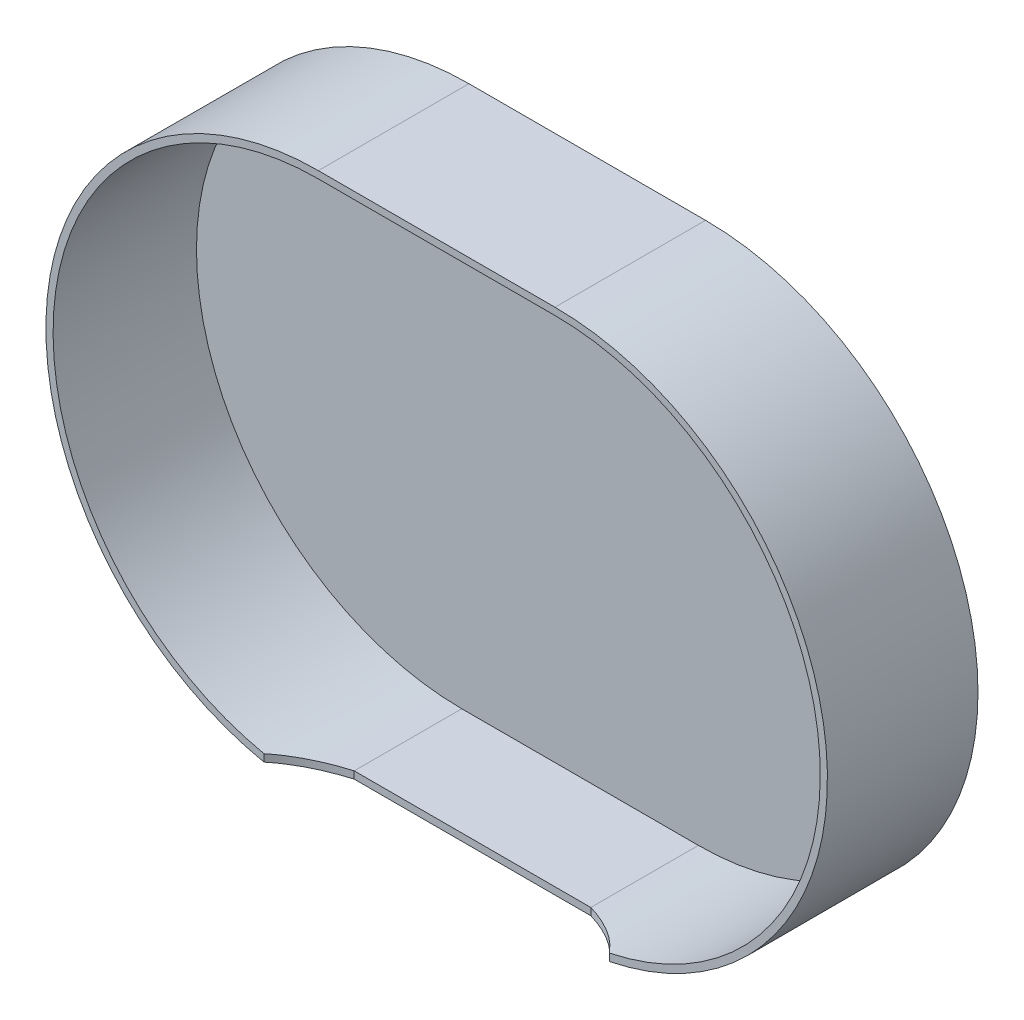
ISO-10303-21;
HEADER;
FILE_DESCRIPTION(('STEP AP214'),'2;1');
FILE_NAME('part.step','',(''),(''),'','','');
FILE_SCHEMA(('AUTOMOTIVE_DESIGN { 1 0 10303 214 1 1 1 1 }'));
ENDSEC;
DATA;
#1=APPLICATION_CONTEXT('core data for automotive mechanical design processes');
#2=APPLICATION_PROTOCOL_DEFINITION('international standard','automotive_design',2000,#1);
#3=PRODUCT_CONTEXT('',#1,'mechanical');
#4=PRODUCT('Part','Part','',(#3));
#5=PRODUCT_RELATED_PRODUCT_CATEGORY('part','',(#4));
#6=PRODUCT_DEFINITION_FORMATION('','',#4);
#7=PRODUCT_DEFINITION_CONTEXT('part definition',#1,'design');
#8=PRODUCT_DEFINITION('design','',#6,#7);
#9=PRODUCT_DEFINITION_SHAPE('','',#8);
#10=(LENGTH_UNIT() NAMED_UNIT(*) SI_UNIT(.MILLI.,.METRE.));
#11=(NAMED_UNIT(*) PLANE_ANGLE_UNIT() SI_UNIT($,.RADIAN.));
#12=(NAMED_UNIT(*) SI_UNIT($,.STERADIAN.) SOLID_ANGLE_UNIT());
#13=UNCERTAINTY_MEASURE_WITH_UNIT(LENGTH_MEASURE(1.E-05),#10,'distance_accuracy_value','');
#14=(GEOMETRIC_REPRESENTATION_CONTEXT(3) GLOBAL_UNCERTAINTY_ASSIGNED_CONTEXT((#13)) GLOBAL_UNIT_ASSIGNED_CONTEXT((#10,
#11,#12)) REPRESENTATION_CONTEXT('',''));
#15=CARTESIAN_POINT('',(0.,0.,0.));
#16=DIRECTION('',(0.,0.,1.));
#17=DIRECTION('',(1.,0.,0.));
#18=AXIS2_PLACEMENT_3D('',#15,#16,#17);
#19=CARTESIAN_POINT('',(33.,-38.,1.));
#20=DIRECTION('',(0.,1.,0.));
#21=DIRECTION('',(-1.,0.,0.));
#22=AXIS2_PLACEMENT_3D('',#19,#20,#21);
#23=PLANE('',#22);
#24=DIRECTION('',(-1.,0.,0.));
#25=VECTOR('',#24,1.);
#26=CARTESIAN_POINT('',(0.,-38.,16.));
#27=LINE('',#26,#25);
#28=CARTESIAN_POINT('',(33.,-38.,16.));
#29=VERTEX_POINT('',#28);
#30=CARTESIAN_POINT('',(0.,-38.,16.));
#31=VERTEX_POINT('',#30);
#32=EDGE_CURVE('E123',#29,#31,#27,.T.);
#33=ORIENTED_EDGE('',*,*,#32,.T.);
#34=DIRECTION('',(0.,0.,-1.));
#35=VECTOR('',#34,1.);
#36=CARTESIAN_POINT('',(0.,-38.,1.));
#37=LINE('',#36,#35);
#38=CARTESIAN_POINT('',(0.,-38.,0.));
#39=VERTEX_POINT('',#38);
#40=EDGE_CURVE('E48',#31,#39,#37,.T.);
#41=ORIENTED_EDGE('',*,*,#40,.T.);
#42=DIRECTION('',(1.,0.,0.));
#43=VECTOR('',#42,1.);
#44=CARTESIAN_POINT('',(33.,-38.,0.));
#45=LINE('',#44,#43);
#46=CARTESIAN_POINT('',(33.,-38.,0.));
#47=VERTEX_POINT('',#46);
#48=EDGE_CURVE('E144',#39,#47,#45,.T.);
#49=ORIENTED_EDGE('',*,*,#48,.T.);
#50=DIRECTION('',(0.,0.,-1.));
#51=VECTOR('',#50,1.);
#52=CARTESIAN_POINT('',(33.,-38.,1.));
#53=LINE('',#52,#51);
#54=EDGE_CURVE('E137',#29,#47,#53,.T.);
#55=ORIENTED_EDGE('',*,*,#54,.F.);
#56=EDGE_LOOP('',(#33,#41,#49,#55));
#57=FACE_BOUND('',#56,.T.);
#58=ADVANCED_FACE('F34',(#57),#23,.F.);
#59=CARTESIAN_POINT('',(33.,-37.,21.));
#60=DIRECTION('',(0.,1.,0.));
#61=DIRECTION('',(-1.,0.,0.));
#62=AXIS2_PLACEMENT_3D('',#59,#60,#61);
#63=PLANE('',#62);
#64=DIRECTION('',(0.,0.,-1.));
#65=VECTOR('',#64,1.);
#66=CARTESIAN_POINT('',(0.,-37.,21.));
#67=LINE('',#66,#65);
#68=CARTESIAN_POINT('',(0.,-37.,16.));
#69=VERTEX_POINT('',#68);
#70=CARTESIAN_POINT('',(0.,-37.,1.));
#71=VERTEX_POINT('',#70);
#72=EDGE_CURVE('E62',#69,#71,#67,.T.);
#73=ORIENTED_EDGE('',*,*,#72,.F.);
#74=DIRECTION('',(1.,0.,0.));
#75=VECTOR('',#74,1.);
#76=CARTESIAN_POINT('',(33.,-37.,16.));
#77=LINE('',#76,#75);
#78=CARTESIAN_POINT('',(33.,-37.,16.));
#79=VERTEX_POINT('',#78);
#80=EDGE_CURVE('E141',#69,#79,#77,.T.);
#81=ORIENTED_EDGE('',*,*,#80,.T.);
#82=DIRECTION('',(0.,0.,-1.));
#83=VECTOR('',#82,1.);
#84=CARTESIAN_POINT('',(33.,-37.,21.));
#85=LINE('',#84,#83);
#86=CARTESIAN_POINT('',(33.,-37.,1.));
#87=VERTEX_POINT('',#86);
#88=EDGE_CURVE('E170',#79,#87,#85,.T.);
#89=ORIENTED_EDGE('',*,*,#88,.T.);
#90=DIRECTION('',(1.,0.,0.));
#91=VECTOR('',#90,1.);
#92=CARTESIAN_POINT('',(33.,-37.,1.));
#93=LINE('',#92,#91);
#94=EDGE_CURVE('E184',#71,#87,#93,.T.);
#95=ORIENTED_EDGE('',*,*,#94,.F.);
#96=EDGE_LOOP('',(#73,#81,#89,#95));
#97=FACE_BOUND('',#96,.T.);
#98=ADVANCED_FACE('F229',(#97),#63,.T.);
#99=CARTESIAN_POINT('',(0.,0.,1.));
#100=DIRECTION('',(0.,0.,-1.));
#101=DIRECTION('',(-1.,0.,0.));
#102=AXIS2_PLACEMENT_3D('',#99,#100,#101);
#103=CYLINDRICAL_SURFACE('',#102,38.);
#104=ORIENTED_EDGE('',*,*,#40,.F.);
#105=CARTESIAN_POINT('',(0.,-38.,16.));
#106=CARTESIAN_POINT('',(-0.209668294894999,-38.0000020420965,16.0623704349651));
#107=CARTESIAN_POINT('',(-0.417997668829685,-37.9982641918919,16.129129762484));
#108=CARTESIAN_POINT('',(-0.83161853382481,-37.991461819907,16.2712975465837));
#109=CARTESIAN_POINT('',(-1.03691016580021,-37.9863974529351,16.3467056005377));
#110=CARTESIAN_POINT('',(-1.6475260632566,-37.9664502269467,16.5856442861078));
#111=CARTESIAN_POINT('',(-2.04778916412714,-37.9468129555652,16.7619483357872));
#112=CARTESIAN_POINT('',(-2.82192697590169,-37.8970130968414,17.1423416945749));
#113=CARTESIAN_POINT('',(-3.19620778444654,-37.8671198961498,17.3456452970956));
#114=CARTESIAN_POINT('',(-3.92634507026778,-37.7983890287726,17.7816461654427));
#115=CARTESIAN_POINT('',(-4.28220382361375,-37.7595524702967,18.0143397878144));
#116=CARTESIAN_POINT('',(-4.8993440805356,-37.6838347477862,18.4546857181574));
#117=CARTESIAN_POINT('',(-5.16458327779888,-37.6483098563186,18.6570599064528));
#118=CARTESIAN_POINT('',(-5.68131255592979,-37.5738048677852,19.0780738027897));
#119=CARTESIAN_POINT('',(-5.93280303919229,-37.5348248719305,19.2967130343461));
#120=CARTESIAN_POINT('',(-6.42593072342384,-37.4535857233315,19.7538410001837));
#121=CARTESIAN_POINT('',(-6.66727534744955,-37.4112770226346,19.9926364098078));
#122=CARTESIAN_POINT('',(-7.13384009211749,-37.3251211554788,20.4852769621082));
#123=CARTESIAN_POINT('',(-7.35905863052002,-37.281273838683,20.7391235771056));
#124=CARTESIAN_POINT('',(-7.57575757575759,-37.2371843343902,21.));
#125=B_SPLINE_CURVE_WITH_KNOTS('',3,(#105,#106,#107,#108,#109,#110,#111,#112,#113,#114,#115,
#116,#117,#118,#119,#120,#121,#122,#123,#124),.UNSPECIFIED.,.F.,.F.,(4,2,2,2,2,2,2,2,2,4),(0.,
0.656127835070239,1.31222513761848,2.62380270636542,3.90327755133892,5.18259393634249,
6.18847110209257,7.19431881223342,8.22002579273632,9.24583327479483),.UNSPECIFIED.);
#126=CARTESIAN_POINT('',(-7.57575757575759,-37.2371843343902,21.));
#127=VERTEX_POINT('',#126);
#128=EDGE_CURVE('E189',#31,#127,#125,.T.);
#129=ORIENTED_EDGE('',*,*,#128,.T.);
#130=CARTESIAN_POINT('',(0.,0.,21.));
#131=DIRECTION('',(0.,0.,1.));
#132=DIRECTION('',(1.,0.,0.));
#133=AXIS2_PLACEMENT_3D('',#130,#131,#132);
#134=CIRCLE('',#133,38.);
#135=CARTESIAN_POINT('',(0.,38.,21.));
#136=VERTEX_POINT('',#135);
#137=EDGE_CURVE('E166',#136,#127,#134,.T.);
#138=ORIENTED_EDGE('',*,*,#137,.F.);
#139=DIRECTION('',(0.,0.,-1.));
#140=VECTOR('',#139,1.);
#141=CARTESIAN_POINT('',(0.,38.,1.));
#142=LINE('',#141,#140);
#143=CARTESIAN_POINT('',(0.,38.,0.));
#144=VERTEX_POINT('',#143);
#145=EDGE_CURVE('E149',#136,#144,#142,.T.);
#146=ORIENTED_EDGE('',*,*,#145,.T.);
#147=CARTESIAN_POINT('',(0.,0.,0.));
#148=DIRECTION('',(0.,0.,1.));
#149=DIRECTION('',(1.,0.,0.));
#150=AXIS2_PLACEMENT_3D('',#147,#148,#149);
#151=CIRCLE('',#150,38.);
#152=EDGE_CURVE('E159',#144,#39,#151,.T.);
#153=ORIENTED_EDGE('',*,*,#152,.T.);
#154=EDGE_LOOP('',(#104,#129,#138,#146,#153));
#155=FACE_BOUND('',#154,.T.);
#156=ADVANCED_FACE('F36',(#155),#103,.T.);
#157=CARTESIAN_POINT('',(33.,0.,1.));
#158=DIRECTION('',(0.,0.,-1.));
#159=DIRECTION('',(-1.,0.,0.));
#160=AXIS2_PLACEMENT_3D('',#157,#158,#159);
#161=CYLINDRICAL_SURFACE('',#160,38.);
#162=CARTESIAN_POINT('',(33.,0.,21.));
#163=DIRECTION('',(0.,0.,1.));
#164=DIRECTION('',(1.,0.,0.));
#165=AXIS2_PLACEMENT_3D('',#162,#163,#164);
#166=CIRCLE('',#165,38.);
#167=CARTESIAN_POINT('',(40.5757575757576,-37.2371843343902,21.));
#168=VERTEX_POINT('',#167);
#169=CARTESIAN_POINT('',(33.,38.,21.));
#170=VERTEX_POINT('',#169);
#171=EDGE_CURVE('E140',#168,#170,#166,.T.);
#172=ORIENTED_EDGE('',*,*,#171,.F.);
#173=CARTESIAN_POINT('',(40.5757575757576,-37.2371843343902,21.));
#174=CARTESIAN_POINT('',(40.2970498078686,-37.2938974050105,20.6644435168226));
#175=CARTESIAN_POINT('',(40.0042143461818,-37.3502055014916,20.3405224365122));
#176=CARTESIAN_POINT('',(39.3921448725725,-37.4598042543666,19.7178995669108));
#177=CARTESIAN_POINT('',(39.0729022134796,-37.513093912657,19.419206103757));
#178=CARTESIAN_POINT('',(38.4183255580719,-37.6131448573562,18.8563172067895));
#179=CARTESIAN_POINT('',(38.0835913452064,-37.6600358023563,18.5914472445636));
#180=CARTESIAN_POINT('',(37.3930651195587,-37.7468139018455,18.0896068260648));
#181=CARTESIAN_POINT('',(37.0372790751411,-37.7867030288059,17.8526285186947));
#182=CARTESIAN_POINT('',(36.3886811375766,-37.8496760072285,17.458008300246));
#183=CARTESIAN_POINT('',(36.099600848681,-37.8745229186199,17.2944817375607));
#184=CARTESIAN_POINT('',(35.5112830851958,-37.9180755424548,16.9859907663782));
#185=CARTESIAN_POINT('',(35.2120470419719,-37.9367821163922,16.8410237557043));
#186=CARTESIAN_POINT('',(34.5986480165739,-37.9676224620414,16.5676574353752));
#187=CARTESIAN_POINT('',(34.2843069471591,-37.9796191219273,16.4396418908669));
#188=CARTESIAN_POINT('',(33.6477065102548,-37.9958198322104,16.2042035379511));
#189=CARTESIAN_POINT('',(33.3254448225488,-38.0000215709679,16.0967868467458));
#190=CARTESIAN_POINT('',(33.,-38.,16.));
#191=B_SPLINE_CURVE_WITH_KNOTS('',3,(#173,#174,#175,#176,#177,#178,#179,#180,#181,#182,#183,
#184,#185,#186,#187,#188,#189,#190),.UNSPECIFIED.,.F.,.F.,(4,2,2,2,2,2,2,2,4),(0.,
1.31929809427254,2.63902992267524,3.92585195060482,5.21231088605074,6.21079133696975,
7.20913164039855,8.22718947189252,9.24554916747667),.UNSPECIFIED.);
#192=EDGE_CURVE('E120',#168,#29,#191,.T.);
#193=ORIENTED_EDGE('',*,*,#192,.T.);
#194=ORIENTED_EDGE('',*,*,#54,.T.);
#195=CARTESIAN_POINT('',(33.,0.,0.));
#196=DIRECTION('',(0.,0.,1.));
#197=DIRECTION('',(1.,0.,0.));
#198=AXIS2_PLACEMENT_3D('',#195,#196,#197);
#199=CIRCLE('',#198,38.);
#200=CARTESIAN_POINT('',(33.,38.,0.));
#201=VERTEX_POINT('',#200);
#202=EDGE_CURVE('E156',#47,#201,#199,.T.);
#203=ORIENTED_EDGE('',*,*,#202,.T.);
#204=DIRECTION('',(0.,0.,-1.));
#205=VECTOR('',#204,1.);
#206=CARTESIAN_POINT('',(33.,38.,1.));
#207=LINE('',#206,#205);
#208=EDGE_CURVE('E146',#170,#201,#207,.T.);
#209=ORIENTED_EDGE('',*,*,#208,.F.);
#210=EDGE_LOOP('',(#172,#193,#194,#203,#209));
#211=FACE_BOUND('',#210,.T.);
#212=ADVANCED_FACE('F136',(#211),#161,.T.);
#213=CARTESIAN_POINT('',(0.,38.,1.));
#214=DIRECTION('',(0.,-1.,0.));
#215=DIRECTION('',(1.,0.,0.));
#216=AXIS2_PLACEMENT_3D('',#213,#214,#215);
#217=PLANE('',#216);
#218=DIRECTION('',(-1.,0.,0.));
#219=VECTOR('',#218,1.);
#220=CARTESIAN_POINT('',(0.,38.,0.));
#221=LINE('',#220,#219);
#222=EDGE_CURVE('E154',#201,#144,#221,.T.);
#223=ORIENTED_EDGE('',*,*,#222,.T.);
#224=ORIENTED_EDGE('',*,*,#145,.F.);
#225=DIRECTION('',(-1.,0.,0.));
#226=VECTOR('',#225,1.);
#227=CARTESIAN_POINT('',(0.,38.,21.));
#228=LINE('',#227,#226);
#229=EDGE_CURVE('E162',#170,#136,#228,.T.);
#230=ORIENTED_EDGE('',*,*,#229,.F.);
#231=ORIENTED_EDGE('',*,*,#208,.T.);
#232=EDGE_LOOP('',(#223,#224,#230,#231));
#233=FACE_BOUND('',#232,.T.);
#234=ADVANCED_FACE('F226',(#233),#217,.F.);
#235=CARTESIAN_POINT('',(0.,0.,0.));
#236=DIRECTION('',(0.,0.,1.));
#237=DIRECTION('',(1.,0.,0.));
#238=AXIS2_PLACEMENT_3D('',#235,#236,#237);
#239=PLANE('',#238);
#240=ORIENTED_EDGE('',*,*,#152,.F.);
#241=ORIENTED_EDGE('',*,*,#222,.F.);
#242=ORIENTED_EDGE('',*,*,#202,.F.);
#243=ORIENTED_EDGE('',*,*,#48,.F.);
#244=EDGE_LOOP('',(#240,#241,#242,#243));
#245=FACE_BOUND('',#244,.T.);
#246=ADVANCED_FACE('F248',(#245),#239,.F.);
#247=CARTESIAN_POINT('',(0.,0.,21.));
#248=DIRECTION('',(0.,0.,1.));
#249=DIRECTION('',(1.,0.,0.));
#250=AXIS2_PLACEMENT_3D('',#247,#248,#249);
#251=PLANE('',#250);
#252=DIRECTION('',(0.,-1.,0.));
#253=VECTOR('',#252,1.);
#254=CARTESIAN_POINT('',(-7.57575757575758,-18.,21.));
#255=LINE('',#254,#253);
#256=CARTESIAN_POINT('',(-7.57575757575759,-36.2161275836243,21.));
#257=VERTEX_POINT('',#256);
#258=EDGE_CURVE('E266',#257,#127,#255,.T.);
#259=ORIENTED_EDGE('',*,*,#258,.F.);
#260=CARTESIAN_POINT('',(0.,0.,21.));
#261=DIRECTION('',(0.,0.,1.));
#262=DIRECTION('',(1.,0.,0.));
#263=AXIS2_PLACEMENT_3D('',#260,#261,#262);
#264=CIRCLE('',#263,37.);
#265=CARTESIAN_POINT('',(0.,37.,21.));
#266=VERTEX_POINT('',#265);
#267=EDGE_CURVE('E181',#266,#257,#264,.T.);
#268=ORIENTED_EDGE('',*,*,#267,.F.);
#269=DIRECTION('',(-1.,0.,0.));
#270=VECTOR('',#269,1.);
#271=CARTESIAN_POINT('',(0.,37.,21.));
#272=LINE('',#271,#270);
#273=CARTESIAN_POINT('',(33.,37.,21.));
#274=VERTEX_POINT('',#273);
#275=EDGE_CURVE('E178',#274,#266,#272,.T.);
#276=ORIENTED_EDGE('',*,*,#275,.F.);
#277=CARTESIAN_POINT('',(33.,0.,21.));
#278=DIRECTION('',(0.,0.,1.));
#279=DIRECTION('',(1.,0.,0.));
#280=AXIS2_PLACEMENT_3D('',#277,#278,#279);
#281=CIRCLE('',#280,37.);
#282=CARTESIAN_POINT('',(40.5757575757576,-36.2161275836243,21.));
#283=VERTEX_POINT('',#282);
#284=EDGE_CURVE('E191',#283,#274,#281,.T.);
#285=ORIENTED_EDGE('',*,*,#284,.F.);
#286=DIRECTION('',(0.,-1.,0.));
#287=VECTOR('',#286,1.);
#288=CARTESIAN_POINT('',(40.5757575757576,-18.,21.));
#289=LINE('',#288,#287);
#290=EDGE_CURVE('E54',#283,#168,#289,.T.);
#291=ORIENTED_EDGE('',*,*,#290,.T.);
#292=ORIENTED_EDGE('',*,*,#171,.T.);
#293=ORIENTED_EDGE('',*,*,#229,.T.);
#294=ORIENTED_EDGE('',*,*,#137,.T.);
#295=EDGE_LOOP('',(#259,#268,#276,#285,#291,#292,#293,#294));
#296=FACE_BOUND('',#295,.T.);
#297=ADVANCED_FACE('F245',(#296),#251,.T.);
#298=CARTESIAN_POINT('',(0.,0.,21.));
#299=DIRECTION('',(0.,0.,-1.));
#300=DIRECTION('',(-1.,0.,0.));
#301=AXIS2_PLACEMENT_3D('',#298,#299,#300);
#302=CYLINDRICAL_SURFACE('',#301,37.);
#303=CARTESIAN_POINT('',(0.,-37.,16.));
#304=CARTESIAN_POINT('',(-0.209464203208103,-37.0000020878884,16.062309672226));
#305=CARTESIAN_POINT('',(-0.417591835696334,-36.9982207484998,16.1289997287339));
#306=CARTESIAN_POINT('',(-0.830812514283704,-36.9912480060549,16.2710110744306));
#307=CARTESIAN_POINT('',(-1.03590570702713,-36.9860567683416,16.3463319449727));
#308=CARTESIAN_POINT('',(-1.64592287148787,-36.9656097688729,16.5849783752154));
#309=CARTESIAN_POINT('',(-2.04578996774942,-36.9454804147878,16.76104894252));
#310=CARTESIAN_POINT('',(-2.81914650636631,-36.8944307352172,17.1408949541617));
#311=CARTESIAN_POINT('',(-3.19304216160572,-36.8637868374823,17.3438860465953));
#312=CARTESIAN_POINT('',(-3.92242779294003,-36.7933247496619,17.7791771921452));
#313=CARTESIAN_POINT('',(-4.27791993194539,-36.7535076406883,18.0114737899933));
#314=CARTESIAN_POINT('',(-4.8951866365259,-36.6757746258649,18.4515711456213));
#315=CARTESIAN_POINT('',(-5.16087747141418,-36.6392385244723,18.6541576741753));
#316=CARTESIAN_POINT('',(-5.67845794243215,-36.5625975712733,19.0756323167338));
#317=CARTESIAN_POINT('',(-5.93034796103417,-36.5224928184486,19.2945199785758));
#318=CARTESIAN_POINT('',(-6.42425025147648,-36.4388937302178,19.7521994906299));
#319=CARTESIAN_POINT('',(-6.66596779737725,-36.3953479678727,19.9912998548071));
#320=CARTESIAN_POINT('',(-7.13322516916333,-36.3066621383504,20.4845837427826));
#321=CARTESIAN_POINT('',(-7.35876348749723,-36.2615219231882,20.7387686681116));
#322=CARTESIAN_POINT('',(-7.57575757575758,-36.2161275836243,21.));
#323=B_SPLINE_CURVE_WITH_KNOTS('',3,(#303,#304,#305,#306,#307,#308,#309,#310,#311,#312,#313,
#314,#315,#316,#317,#318,#319,#320,#321,#322),.UNSPECIFIED.,.F.,.F.,(4,2,2,2,2,2,2,2,2,4),(0.,
0.655488508959944,1.31094523620375,2.62121763309854,3.8993921048295,5.1774160138918,
6.18506944366358,7.19269493344301,8.22029148119828,9.24798365452169),.UNSPECIFIED.);
#324=EDGE_CURVE('E201',#69,#257,#323,.T.);
#325=ORIENTED_EDGE('',*,*,#324,.F.);
#326=ORIENTED_EDGE('',*,*,#72,.T.);
#327=CARTESIAN_POINT('',(0.,0.,1.));
#328=DIRECTION('',(0.,0.,1.));
#329=DIRECTION('',(1.,0.,0.));
#330=AXIS2_PLACEMENT_3D('',#327,#328,#329);
#331=CIRCLE('',#330,37.);
#332=CARTESIAN_POINT('',(0.,37.,1.));
#333=VERTEX_POINT('',#332);
#334=EDGE_CURVE('E187',#333,#71,#331,.T.);
#335=ORIENTED_EDGE('',*,*,#334,.F.);
#336=DIRECTION('',(0.,0.,-1.));
#337=VECTOR('',#336,1.);
#338=CARTESIAN_POINT('',(0.,37.,21.));
#339=LINE('',#338,#337);
#340=EDGE_CURVE('E175',#266,#333,#339,.T.);
#341=ORIENTED_EDGE('',*,*,#340,.F.);
#342=ORIENTED_EDGE('',*,*,#267,.T.);
#343=EDGE_LOOP('',(#325,#326,#335,#341,#342));
#344=FACE_BOUND('',#343,.T.);
#345=ADVANCED_FACE('F241',(#344),#302,.F.);
#346=CARTESIAN_POINT('',(33.,0.,21.));
#347=DIRECTION('',(0.,0.,-1.));
#348=DIRECTION('',(-1.,0.,0.));
#349=AXIS2_PLACEMENT_3D('',#346,#347,#348);
#350=CYLINDRICAL_SURFACE('',#349,37.);
#351=CARTESIAN_POINT('',(40.5757575757576,-36.2161275836243,21.));
#352=CARTESIAN_POINT('',(40.297368219077,-36.274373003042,20.6648282766272));
#353=CARTESIAN_POINT('',(40.0048813873641,-36.3321956988007,20.3412601861774));
#354=CARTESIAN_POINT('',(39.3935459518364,-36.4447384549226,19.7192658611832));
#355=CARTESIAN_POINT('',(39.0746884399946,-36.4994574562469,19.4208481917589));
#356=CARTESIAN_POINT('',(38.4209053850064,-36.6021936207672,18.8584329034694));
#357=CARTESIAN_POINT('',(38.0865801935018,-36.6503440518215,18.5937616814347));
#358=CARTESIAN_POINT('',(37.3968744728867,-36.7394651021288,18.09223447252));
#359=CARTESIAN_POINT('',(37.0414999478107,-36.7804377556737,17.855370610907));
#360=CARTESIAN_POINT('',(36.3930321407378,-36.8451987021495,17.4605220896457));
#361=CARTESIAN_POINT('',(36.103649351477,-36.8707823858445,17.2967060882429));
#362=CARTESIAN_POINT('',(35.5146759038706,-36.9156284316376,16.9876696514984));
#363=CARTESIAN_POINT('',(35.2150866863778,-36.9348916819498,16.8424466050287));
#364=CARTESIAN_POINT('',(34.6009080760183,-36.9666523852064,16.5685957240248));
#365=CARTESIAN_POINT('',(34.2861390607448,-36.9790081552649,16.4403539070183));
#366=CARTESIAN_POINT('',(33.6486461880308,-36.9956943201327,16.2045167119326));
#367=CARTESIAN_POINT('',(33.3259199410638,-37.0000222737299,16.0969276231415));
#368=CARTESIAN_POINT('',(33.,-37.,16.));
#369=B_SPLINE_CURVE_WITH_KNOTS('',3,(#351,#352,#353,#354,#355,#356,#357,#358,#359,#360,#361,
#362,#363,#364,#365,#366,#367,#368),.UNSPECIFIED.,.F.,.F.,(4,2,2,2,2,2,2,2,4),(0.,
1.31841704255764,2.63728128041364,3.92320008332413,5.20875384549807,6.20861005066394,
7.2083256852203,8.22785801426655,9.24770032635517),.UNSPECIFIED.);
#370=EDGE_CURVE('E11',#283,#79,#369,.T.);
#371=ORIENTED_EDGE('',*,*,#370,.F.);
#372=ORIENTED_EDGE('',*,*,#284,.T.);
#373=DIRECTION('',(0.,0.,-1.));
#374=VECTOR('',#373,1.);
#375=CARTESIAN_POINT('',(33.,37.,21.));
#376=LINE('',#375,#374);
#377=CARTESIAN_POINT('',(33.,37.,1.));
#378=VERTEX_POINT('',#377);
#379=EDGE_CURVE('E172',#274,#378,#376,.T.);
#380=ORIENTED_EDGE('',*,*,#379,.T.);
#381=CARTESIAN_POINT('',(33.,0.,1.));
#382=DIRECTION('',(0.,0.,1.));
#383=DIRECTION('',(1.,0.,0.));
#384=AXIS2_PLACEMENT_3D('',#381,#382,#383);
#385=CIRCLE('',#384,37.);
#386=EDGE_CURVE('E182',#87,#378,#385,.T.);
#387=ORIENTED_EDGE('',*,*,#386,.F.);
#388=ORIENTED_EDGE('',*,*,#88,.F.);
#389=EDGE_LOOP('',(#371,#372,#380,#387,#388));
#390=FACE_BOUND('',#389,.T.);
#391=ADVANCED_FACE('F239',(#390),#350,.F.);
#392=CARTESIAN_POINT('',(0.,37.,21.));
#393=DIRECTION('',(0.,-1.,0.));
#394=DIRECTION('',(1.,0.,0.));
#395=AXIS2_PLACEMENT_3D('',#392,#393,#394);
#396=PLANE('',#395);
#397=DIRECTION('',(-1.,0.,0.));
#398=VECTOR('',#397,1.);
#399=CARTESIAN_POINT('',(0.,37.,1.));
#400=LINE('',#399,#398);
#401=EDGE_CURVE('E179',#378,#333,#400,.T.);
#402=ORIENTED_EDGE('',*,*,#401,.F.);
#403=ORIENTED_EDGE('',*,*,#379,.F.);
#404=ORIENTED_EDGE('',*,*,#275,.T.);
#405=ORIENTED_EDGE('',*,*,#340,.T.);
#406=EDGE_LOOP('',(#402,#403,#404,#405));
#407=FACE_BOUND('',#406,.T.);
#408=ADVANCED_FACE('F251',(#407),#396,.T.);
#409=CARTESIAN_POINT('',(0.,0.,1.));
#410=DIRECTION('',(0.,0.,1.));
#411=DIRECTION('',(1.,0.,0.));
#412=AXIS2_PLACEMENT_3D('',#409,#410,#411);
#413=PLANE('',#412);
#414=ORIENTED_EDGE('',*,*,#334,.T.);
#415=ORIENTED_EDGE('',*,*,#94,.T.);
#416=ORIENTED_EDGE('',*,*,#386,.T.);
#417=ORIENTED_EDGE('',*,*,#401,.T.);
#418=EDGE_LOOP('',(#414,#415,#416,#417));
#419=FACE_BOUND('',#418,.T.);
#420=ADVANCED_FACE('F210',(#419),#413,.T.);
#421=CARTESIAN_POINT('',(4.46212121212121,-18.,31.));
#422=DIRECTION('',(0.,-1.,0.));
#423=DIRECTION('',(1.,0.,0.));
#424=AXIS2_PLACEMENT_3D('',#421,#422,#423);
#425=CYLINDRICAL_SURFACE('',#424,15.6496174302014);
#426=DIRECTION('',(0.,-1.,0.));
#427=VECTOR('',#426,1.);
#428=CARTESIAN_POINT('',(0.,-18.,16.));
#429=LINE('',#428,#427);
#430=EDGE_CURVE('E129',#69,#31,#429,.T.);
#431=ORIENTED_EDGE('',*,*,#430,.F.);
#432=ORIENTED_EDGE('',*,*,#324,.T.);
#433=ORIENTED_EDGE('',*,*,#258,.T.);
#434=ORIENTED_EDGE('',*,*,#128,.F.);
#435=EDGE_LOOP('',(#431,#432,#433,#434));
#436=FACE_BOUND('',#435,.T.);
#437=ADVANCED_FACE('F207',(#436),#425,.F.);
#438=CARTESIAN_POINT('',(28.5378787878788,-18.,31.));
#439=DIRECTION('',(0.,-1.,0.));
#440=DIRECTION('',(1.,0.,0.));
#441=AXIS2_PLACEMENT_3D('',#438,#439,#440);
#442=CYLINDRICAL_SURFACE('',#441,15.6496174302014);
#443=ORIENTED_EDGE('',*,*,#290,.F.);
#444=ORIENTED_EDGE('',*,*,#370,.T.);
#445=DIRECTION('',(0.,-1.,0.));
#446=VECTOR('',#445,1.);
#447=CARTESIAN_POINT('',(33.,-18.,16.));
#448=LINE('',#447,#446);
#449=EDGE_CURVE('E116',#79,#29,#448,.T.);
#450=ORIENTED_EDGE('',*,*,#449,.T.);
#451=ORIENTED_EDGE('',*,*,#192,.F.);
#452=EDGE_LOOP('',(#443,#444,#450,#451));
#453=FACE_BOUND('',#452,.T.);
#454=ADVANCED_FACE('F118',(#453),#442,.F.);
#455=CARTESIAN_POINT('',(0.,-18.,16.));
#456=DIRECTION('',(0.,0.,1.));
#457=DIRECTION('',(1.,0.,0.));
#458=AXIS2_PLACEMENT_3D('',#455,#456,#457);
#459=PLANE('',#458);
#460=ORIENTED_EDGE('',*,*,#430,.T.);
#461=ORIENTED_EDGE('',*,*,#32,.F.);
#462=ORIENTED_EDGE('',*,*,#449,.F.);
#463=ORIENTED_EDGE('',*,*,#80,.F.);
#464=EDGE_LOOP('',(#460,#461,#462,#463));
#465=FACE_BOUND('',#464,.T.);
#466=ADVANCED_FACE('F127',(#465),#459,.T.);
#467=CLOSED_SHELL('',(#58,#98,#156,#212,#234,#246,#297,#345,#391,#408,#420,#437,#454,#466));
#468=MANIFOLD_SOLID_BREP('B2',#467);
#469=ADVANCED_BREP_SHAPE_REPRESENTATION('',(#18,#468),#14);
#470=SHAPE_DEFINITION_REPRESENTATION(#9,#469);
ENDSEC;
END-ISO-10303-21;
